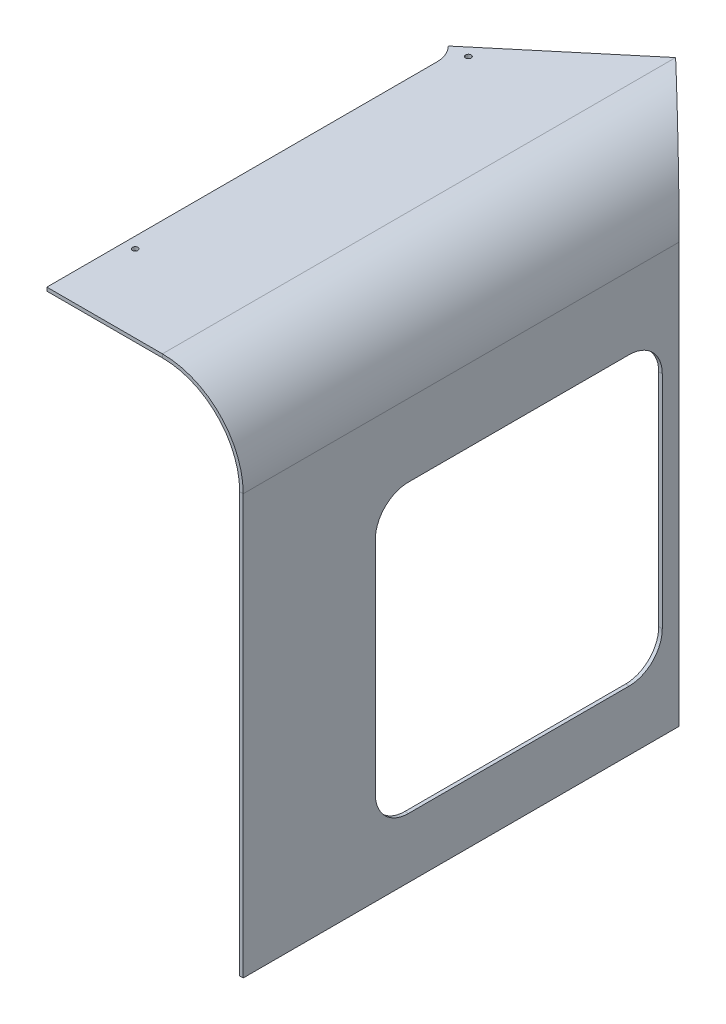
ISO-10303-21;
HEADER;
FILE_DESCRIPTION(('STEP AP214'),'2;1');
FILE_NAME('part.step','',(''),(''),'','','');
FILE_SCHEMA(('AUTOMOTIVE_DESIGN { 1 0 10303 214 1 1 1 1 }'));
ENDSEC;
DATA;
#1=APPLICATION_CONTEXT('core data for automotive mechanical design processes');
#2=APPLICATION_PROTOCOL_DEFINITION('international standard','automotive_design',2000,#1);
#3=PRODUCT_CONTEXT('',#1,'mechanical');
#4=PRODUCT('Part','Part','',(#3));
#5=PRODUCT_RELATED_PRODUCT_CATEGORY('part','',(#4));
#6=PRODUCT_DEFINITION_FORMATION('','',#4);
#7=PRODUCT_DEFINITION_CONTEXT('part definition',#1,'design');
#8=PRODUCT_DEFINITION('design','',#6,#7);
#9=PRODUCT_DEFINITION_SHAPE('','',#8);
#10=(LENGTH_UNIT() NAMED_UNIT(*) SI_UNIT(.MILLI.,.METRE.));
#11=(NAMED_UNIT(*) PLANE_ANGLE_UNIT() SI_UNIT($,.RADIAN.));
#12=(NAMED_UNIT(*) SI_UNIT($,.STERADIAN.) SOLID_ANGLE_UNIT());
#13=UNCERTAINTY_MEASURE_WITH_UNIT(LENGTH_MEASURE(1.E-05),#10,'distance_accuracy_value','');
#14=(GEOMETRIC_REPRESENTATION_CONTEXT(3) GLOBAL_UNCERTAINTY_ASSIGNED_CONTEXT((#13)) GLOBAL_UNIT_ASSIGNED_CONTEXT((#10,
#11,#12)) REPRESENTATION_CONTEXT('',''));
#15=CARTESIAN_POINT('',(0.,0.,0.));
#16=DIRECTION('',(0.,0.,1.));
#17=DIRECTION('',(1.,0.,0.));
#18=AXIS2_PLACEMENT_3D('',#15,#16,#17);
#19=CARTESIAN_POINT('',(250.,-0.0101030776406552,-195.));
#20=DIRECTION('',(-0.642404184639349,0.,-0.766366011483973));
#21=DIRECTION('',(-0.766366011483973,0.,0.642404184639349));
#22=AXIS2_PLACEMENT_3D('',#19,#20,#21);
#23=PLANE('',#22);
#24=DIRECTION('',(0.,1.,0.));
#25=VECTOR('',#24,1.);
#26=CARTESIAN_POINT('',(250.,450.,-195.));
#27=LINE('',#26,#25);
#28=CARTESIAN_POINT('',(250.,450.,-195.));
#29=VERTEX_POINT('',#28);
#30=CARTESIAN_POINT('',(250.,453.2,-195.));
#31=VERTEX_POINT('',#30);
#32=EDGE_CURVE('E177',#29,#31,#27,.T.);
#33=ORIENTED_EDGE('',*,*,#32,.F.);
#34=DIRECTION('',(-0.766366011483973,0.,0.642404184639349));
#35=VECTOR('',#34,1.);
#36=CARTESIAN_POINT('',(-235.661957548569,450.,212.104789583773));
#37=LINE('',#36,#35);
#38=CARTESIAN_POINT('',(137.949402277664,450.,-101.073897081128));
#39=VERTEX_POINT('',#38);
#40=EDGE_CURVE('E163',#29,#39,#37,.T.);
#41=ORIENTED_EDGE('',*,*,#40,.T.);
#42=DIRECTION('',(0.,1.,0.));
#43=VECTOR('',#42,1.);
#44=CARTESIAN_POINT('',(137.949402277664,353.2,-101.073897081128));
#45=LINE('',#44,#43);
#46=CARTESIAN_POINT('',(137.949402277664,453.2,-101.073897081128));
#47=VERTEX_POINT('',#46);
#48=EDGE_CURVE('E175',#39,#47,#45,.T.);
#49=ORIENTED_EDGE('',*,*,#48,.T.);
#50=DIRECTION('',(-0.766366011483973,0.,0.642404184639349));
#51=VECTOR('',#50,1.);
#52=CARTESIAN_POINT('',(-235.661957548569,453.2,212.104789583773));
#53=LINE('',#52,#51);
#54=EDGE_CURVE('E178',#31,#47,#53,.T.);
#55=ORIENTED_EDGE('',*,*,#54,.F.);
#56=EDGE_LOOP('',(#33,#41,#49,#55));
#57=FACE_BOUND('',#56,.T.);
#58=ADVANCED_FACE('F39',(#57),#23,.T.);
#59=CARTESIAN_POINT('',(320.,0.,270.));
#60=DIRECTION('',(0.,0.,1.));
#61=DIRECTION('',(0.,-1.,0.));
#62=AXIS2_PLACEMENT_3D('',#59,#60,#61);
#63=PLANE('',#62);
#64=DIRECTION('',(1.,0.,0.));
#65=VECTOR('',#64,1.);
#66=CARTESIAN_POINT('',(320.,380.,269.999999999309));
#67=LINE('',#66,#65);
#68=CARTESIAN_POINT('',(320.,380.,269.999999999309));
#69=VERTEX_POINT('',#68);
#70=CARTESIAN_POINT('',(323.2,380.,269.999999999309));
#71=VERTEX_POINT('',#70);
#72=EDGE_CURVE('E384',#69,#71,#67,.T.);
#73=ORIENTED_EDGE('',*,*,#72,.F.);
#74=DIRECTION('',(0.,-1.,0.));
#75=VECTOR('',#74,1.);
#76=CARTESIAN_POINT('',(320.,0.,270.));
#77=LINE('',#76,#75);
#78=CARTESIAN_POINT('',(320.,0.,270.));
#79=VERTEX_POINT('',#78);
#80=EDGE_CURVE('E305',#69,#79,#77,.T.);
#81=ORIENTED_EDGE('',*,*,#80,.T.);
#82=DIRECTION('',(1.,0.,0.));
#83=VECTOR('',#82,1.);
#84=CARTESIAN_POINT('',(320.,0.,270.));
#85=LINE('',#84,#83);
#86=CARTESIAN_POINT('',(323.2,0.,270.));
#87=VERTEX_POINT('',#86);
#88=EDGE_CURVE('E381',#79,#87,#85,.T.);
#89=ORIENTED_EDGE('',*,*,#88,.T.);
#90=DIRECTION('',(0.,1.,0.));
#91=VECTOR('',#90,1.);
#92=CARTESIAN_POINT('',(323.2,450.,269.999999999309));
#93=LINE('',#92,#91);
#94=EDGE_CURVE('E283',#71,#87,#93,.F.);
#95=ORIENTED_EDGE('',*,*,#94,.F.);
#96=EDGE_LOOP('',(#73,#81,#89,#95));
#97=FACE_BOUND('',#96,.T.);
#98=ADVANCED_FACE('F397',(#97),#63,.T.);
#99=CARTESIAN_POINT('',(320.,0.,-265.));
#100=DIRECTION('',(0.,1.,0.));
#101=DIRECTION('',(0.,0.,1.));
#102=AXIS2_PLACEMENT_3D('',#99,#100,#101);
#103=PLANE('',#102);
#104=ORIENTED_EDGE('',*,*,#88,.F.);
#105=DIRECTION('',(0.,0.,1.));
#106=VECTOR('',#105,1.);
#107=CARTESIAN_POINT('',(320.,0.,-265.));
#108=LINE('',#107,#106);
#109=CARTESIAN_POINT('',(320.,8.88178419700125E-13,-125.));
#110=VERTEX_POINT('',#109);
#111=EDGE_CURVE('E316',#110,#79,#108,.T.);
#112=ORIENTED_EDGE('',*,*,#111,.F.);
#113=DIRECTION('',(1.,0.,0.));
#114=VECTOR('',#113,1.);
#115=CARTESIAN_POINT('',(320.,8.88178419700125E-13,-125.));
#116=LINE('',#115,#114);
#117=CARTESIAN_POINT('',(323.2,8.88178419700125E-13,-125.));
#118=VERTEX_POINT('',#117);
#119=EDGE_CURVE('E376',#110,#118,#116,.T.);
#120=ORIENTED_EDGE('',*,*,#119,.T.);
#121=DIRECTION('',(0.,0.,-1.));
#122=VECTOR('',#121,1.);
#123=CARTESIAN_POINT('',(323.2,8.88178419700125E-13,-265.));
#124=LINE('',#123,#122);
#125=EDGE_CURVE('E299',#118,#87,#124,.F.);
#126=ORIENTED_EDGE('',*,*,#125,.T.);
#127=EDGE_LOOP('',(#104,#112,#120,#126));
#128=FACE_BOUND('',#127,.T.);
#129=ADVANCED_FACE('F379',(#128),#103,.F.);
#130=CARTESIAN_POINT('',(323.2,450.,-265.));
#131=DIRECTION('',(1.,0.,0.));
#132=DIRECTION('',(0.,0.,-1.));
#133=AXIS2_PLACEMENT_3D('',#130,#131,#132);
#134=PLANE('',#133);
#135=DIRECTION('',(0.,1.,0.));
#136=VECTOR('',#135,1.);
#137=CARTESIAN_POINT('',(323.2,314.267870560164,-109.716770430356));
#138=LINE('',#137,#136);
#139=CARTESIAN_POINT('',(323.2,84.2678705601637,-109.716770430356));
#140=VERTEX_POINT('',#139);
#141=CARTESIAN_POINT('',(323.2,284.267870560164,-109.716770430356));
#142=VERTEX_POINT('',#141);
#143=EDGE_CURVE('E245',#140,#142,#138,.T.);
#144=ORIENTED_EDGE('',*,*,#143,.F.);
#145=CARTESIAN_POINT('',(323.2,84.2678705601637,-79.716770430356));
#146=DIRECTION('',(1.,0.,0.));
#147=DIRECTION('',(0.,0.,-1.));
#148=AXIS2_PLACEMENT_3D('',#145,#146,#147);
#149=CIRCLE('',#148,30.);
#150=CARTESIAN_POINT('',(323.2,54.2678705601637,-79.716770430356));
#151=VERTEX_POINT('',#150);
#152=EDGE_CURVE('E227',#140,#151,#149,.F.);
#153=ORIENTED_EDGE('',*,*,#152,.T.);
#154=DIRECTION('',(0.,0.,-1.));
#155=VECTOR('',#154,1.);
#156=CARTESIAN_POINT('',(323.2,54.2678705601637,150.283229569644));
#157=LINE('',#156,#155);
#158=CARTESIAN_POINT('',(323.2,54.2678705601637,120.283229569644));
#159=VERTEX_POINT('',#158);
#160=EDGE_CURVE('E183',#159,#151,#157,.T.);
#161=ORIENTED_EDGE('',*,*,#160,.F.);
#162=CARTESIAN_POINT('',(323.2,84.2678705601637,120.283229569644));
#163=DIRECTION('',(1.,0.,0.));
#164=DIRECTION('',(0.,0.,-1.));
#165=AXIS2_PLACEMENT_3D('',#162,#163,#164);
#166=CIRCLE('',#165,30.);
#167=CARTESIAN_POINT('',(323.2,84.2678705601637,150.283229569644));
#168=VERTEX_POINT('',#167);
#169=EDGE_CURVE('E223',#159,#168,#166,.F.);
#170=ORIENTED_EDGE('',*,*,#169,.T.);
#171=DIRECTION('',(0.,-1.,0.));
#172=VECTOR('',#171,1.);
#173=CARTESIAN_POINT('',(323.2,314.267870560164,150.283229569644));
#174=LINE('',#173,#172);
#175=CARTESIAN_POINT('',(323.2,284.267870560164,150.283229569644));
#176=VERTEX_POINT('',#175);
#177=EDGE_CURVE('E186',#176,#168,#174,.T.);
#178=ORIENTED_EDGE('',*,*,#177,.F.);
#179=CARTESIAN_POINT('',(323.2,284.267870560164,120.283229569644));
#180=DIRECTION('',(1.,0.,0.));
#181=DIRECTION('',(0.,0.,-1.));
#182=AXIS2_PLACEMENT_3D('',#179,#180,#181);
#183=CIRCLE('',#182,30.);
#184=CARTESIAN_POINT('',(323.2,314.267870560164,120.283229569644));
#185=VERTEX_POINT('',#184);
#186=EDGE_CURVE('E47',#176,#185,#183,.F.);
#187=ORIENTED_EDGE('',*,*,#186,.T.);
#188=DIRECTION('',(0.,0.,1.));
#189=VECTOR('',#188,1.);
#190=CARTESIAN_POINT('',(323.2,314.267870560164,150.283229569644));
#191=LINE('',#190,#189);
#192=CARTESIAN_POINT('',(323.2,314.267870560164,-79.716770430356));
#193=VERTEX_POINT('',#192);
#194=EDGE_CURVE('E239',#193,#185,#191,.T.);
#195=ORIENTED_EDGE('',*,*,#194,.F.);
#196=CARTESIAN_POINT('',(323.2,284.267870560164,-79.716770430356));
#197=DIRECTION('',(1.,0.,0.));
#198=DIRECTION('',(0.,0.,-1.));
#199=AXIS2_PLACEMENT_3D('',#196,#197,#198);
#200=CIRCLE('',#199,30.);
#201=EDGE_CURVE('E231',#193,#142,#200,.F.);
#202=ORIENTED_EDGE('',*,*,#201,.T.);
#203=EDGE_LOOP('',(#144,#153,#161,#170,#178,#187,#195,#202));
#204=FACE_BOUND('',#203,.T.);
#205=ORIENTED_EDGE('',*,*,#125,.F.);
#206=DIRECTION('',(0.,1.,0.));
#207=VECTOR('',#206,1.);
#208=CARTESIAN_POINT('',(323.2,450.,-125.));
#209=LINE('',#208,#207);
#210=CARTESIAN_POINT('',(323.2,380.,-125.));
#211=VERTEX_POINT('',#210);
#212=EDGE_CURVE('E332',#211,#118,#209,.F.);
#213=ORIENTED_EDGE('',*,*,#212,.F.);
#214=DIRECTION('',(0.,0.,-1.));
#215=VECTOR('',#214,1.);
#216=CARTESIAN_POINT('',(323.2,380.,-265.));
#217=LINE('',#216,#215);
#218=EDGE_CURVE('E328',#211,#71,#217,.F.);
#219=ORIENTED_EDGE('',*,*,#218,.T.);
#220=ORIENTED_EDGE('',*,*,#94,.T.);
#221=EDGE_LOOP('',(#205,#213,#219,#220));
#222=FACE_BOUND('',#221,.T.);
#223=ADVANCED_FACE('F237',(#204,#222),#134,.T.);
#224=CARTESIAN_POINT('',(250.,380.,269.999999998618));
#225=DIRECTION('',(0.,0.,-1.));
#226=DIRECTION('',(-1.,0.,0.));
#227=AXIS2_PLACEMENT_3D('',#224,#225,#226);
#228=PLANE('',#227);
#229=DIRECTION('',(0.,1.,0.));
#230=VECTOR('',#229,1.);
#231=CARTESIAN_POINT('',(250.,450.,269.999999999309));
#232=LINE('',#231,#230);
#233=CARTESIAN_POINT('',(250.,450.,269.999999999309));
#234=VERTEX_POINT('',#233);
#235=CARTESIAN_POINT('',(250.,453.2,269.999999999309));
#236=VERTEX_POINT('',#235);
#237=EDGE_CURVE('E386',#234,#236,#232,.T.);
#238=ORIENTED_EDGE('',*,*,#237,.F.);
#239=CARTESIAN_POINT('',(250.,380.,269.999999998618));
#240=DIRECTION('',(0.,0.,1.));
#241=DIRECTION('',(1.,0.,0.));
#242=AXIS2_PLACEMENT_3D('',#239,#240,#241);
#243=CIRCLE('',#242,70.);
#244=EDGE_CURVE('E294',#234,#69,#243,.F.);
#245=ORIENTED_EDGE('',*,*,#244,.T.);
#246=ORIENTED_EDGE('',*,*,#72,.T.);
#247=CARTESIAN_POINT('',(250.,380.,269.999999999309));
#248=DIRECTION('',(0.,0.,1.));
#249=DIRECTION('',(1.,0.,0.));
#250=AXIS2_PLACEMENT_3D('',#247,#248,#249);
#251=CIRCLE('',#250,73.2);
#252=EDGE_CURVE('E320',#236,#71,#251,.F.);
#253=ORIENTED_EDGE('',*,*,#252,.F.);
#254=EDGE_LOOP('',(#238,#245,#246,#253));
#255=FACE_BOUND('',#254,.T.);
#256=ADVANCED_FACE('F396',(#255),#228,.F.);
#257=CARTESIAN_POINT('',(320.,450.,-265.));
#258=DIRECTION('',(1.,0.,0.));
#259=DIRECTION('',(0.,0.,-1.));
#260=AXIS2_PLACEMENT_3D('',#257,#258,#259);
#261=PLANE('',#260);
#262=DIRECTION('',(0.,-1.,0.));
#263=VECTOR('',#262,1.);
#264=CARTESIAN_POINT('',(320.,450.,150.283229569644));
#265=LINE('',#264,#263);
#266=CARTESIAN_POINT('',(320.,284.267870560164,150.283229569644));
#267=VERTEX_POINT('',#266);
#268=CARTESIAN_POINT('',(320.,84.2678705601637,150.283229569644));
#269=VERTEX_POINT('',#268);
#270=EDGE_CURVE('E195',#267,#269,#265,.T.);
#271=ORIENTED_EDGE('',*,*,#270,.T.);
#272=CARTESIAN_POINT('',(320.,84.2678705601637,120.283229569644));
#273=DIRECTION('',(1.,0.,0.));
#274=DIRECTION('',(0.,0.,-1.));
#275=AXIS2_PLACEMENT_3D('',#272,#273,#274);
#276=CIRCLE('',#275,30.);
#277=CARTESIAN_POINT('',(320.,54.2678705601637,120.283229569644));
#278=VERTEX_POINT('',#277);
#279=EDGE_CURVE('E225',#269,#278,#276,.T.);
#280=ORIENTED_EDGE('',*,*,#279,.T.);
#281=DIRECTION('',(0.,0.,-1.));
#282=VECTOR('',#281,1.);
#283=CARTESIAN_POINT('',(320.,54.2678705601637,-265.));
#284=LINE('',#283,#282);
#285=CARTESIAN_POINT('',(320.,54.2678705601637,-79.716770430356));
#286=VERTEX_POINT('',#285);
#287=EDGE_CURVE('E199',#278,#286,#284,.T.);
#288=ORIENTED_EDGE('',*,*,#287,.T.);
#289=CARTESIAN_POINT('',(320.,84.2678705601637,-79.716770430356));
#290=DIRECTION('',(1.,0.,0.));
#291=DIRECTION('',(0.,0.,-1.));
#292=AXIS2_PLACEMENT_3D('',#289,#290,#291);
#293=CIRCLE('',#292,30.);
#294=CARTESIAN_POINT('',(320.,84.2678705601637,-109.716770430356));
#295=VERTEX_POINT('',#294);
#296=EDGE_CURVE('E229',#286,#295,#293,.T.);
#297=ORIENTED_EDGE('',*,*,#296,.T.);
#298=DIRECTION('',(0.,1.,0.));
#299=VECTOR('',#298,1.);
#300=CARTESIAN_POINT('',(320.,450.,-109.716770430356));
#301=LINE('',#300,#299);
#302=CARTESIAN_POINT('',(320.,284.267870560164,-109.716770430356));
#303=VERTEX_POINT('',#302);
#304=EDGE_CURVE('E202',#295,#303,#301,.T.);
#305=ORIENTED_EDGE('',*,*,#304,.T.);
#306=CARTESIAN_POINT('',(320.,284.267870560164,-79.716770430356));
#307=DIRECTION('',(1.,0.,0.));
#308=DIRECTION('',(0.,0.,-1.));
#309=AXIS2_PLACEMENT_3D('',#306,#307,#308);
#310=CIRCLE('',#309,30.);
#311=CARTESIAN_POINT('',(320.,314.267870560164,-79.716770430356));
#312=VERTEX_POINT('',#311);
#313=EDGE_CURVE('E61',#303,#312,#310,.T.);
#314=ORIENTED_EDGE('',*,*,#313,.T.);
#315=DIRECTION('',(0.,0.,1.));
#316=VECTOR('',#315,1.);
#317=CARTESIAN_POINT('',(320.,314.267870560164,-265.));
#318=LINE('',#317,#316);
#319=CARTESIAN_POINT('',(320.,314.267870560164,120.283229569644));
#320=VERTEX_POINT('',#319);
#321=EDGE_CURVE('E193',#312,#320,#318,.T.);
#322=ORIENTED_EDGE('',*,*,#321,.T.);
#323=CARTESIAN_POINT('',(320.,284.267870560164,120.283229569644));
#324=DIRECTION('',(1.,0.,0.));
#325=DIRECTION('',(0.,0.,-1.));
#326=AXIS2_PLACEMENT_3D('',#323,#324,#325);
#327=CIRCLE('',#326,30.);
#328=EDGE_CURVE('E11',#320,#267,#327,.T.);
#329=ORIENTED_EDGE('',*,*,#328,.T.);
#330=EDGE_LOOP('',(#271,#280,#288,#297,#305,#314,#322,#329));
#331=FACE_BOUND('',#330,.T.);
#332=ORIENTED_EDGE('',*,*,#111,.T.);
#333=ORIENTED_EDGE('',*,*,#80,.F.);
#334=DIRECTION('',(0.,0.,1.));
#335=VECTOR('',#334,1.);
#336=CARTESIAN_POINT('',(320.,380.,-265.));
#337=LINE('',#336,#335);
#338=CARTESIAN_POINT('',(320.,380.,-125.));
#339=VERTEX_POINT('',#338);
#340=EDGE_CURVE('E309',#339,#69,#337,.T.);
#341=ORIENTED_EDGE('',*,*,#340,.F.);
#342=DIRECTION('',(0.,-1.,0.));
#343=VECTOR('',#342,1.);
#344=CARTESIAN_POINT('',(320.,2193.73346549275,-125.));
#345=LINE('',#344,#343);
#346=EDGE_CURVE('E312',#339,#110,#345,.T.);
#347=ORIENTED_EDGE('',*,*,#346,.T.);
#348=EDGE_LOOP('',(#332,#333,#341,#347));
#349=FACE_BOUND('',#348,.T.);
#350=ADVANCED_FACE('F249',(#331,#349),#261,.F.);
#351=CARTESIAN_POINT('',(250.,380.,-265.));
#352=DIRECTION('',(0.,0.,1.));
#353=DIRECTION('',(1.,0.,0.));
#354=AXIS2_PLACEMENT_3D('',#351,#352,#353);
#355=CYLINDRICAL_SURFACE('',#354,70.);
#356=ORIENTED_EDGE('',*,*,#340,.T.);
#357=ORIENTED_EDGE('',*,*,#244,.F.);
#358=DIRECTION('',(0.,0.,1.));
#359=VECTOR('',#358,1.);
#360=CARTESIAN_POINT('',(250.,450.,195.));
#361=LINE('',#360,#359);
#362=EDGE_CURVE('E303',#234,#29,#361,.F.);
#363=ORIENTED_EDGE('',*,*,#362,.T.);
#364=CARTESIAN_POINT('',(250.,380.,-195.));
#365=DIRECTION('',(0.707106781186547,0.,-0.707106781186548));
#366=DIRECTION('',(0.707106781186548,0.,0.707106781186547));
#367=AXIS2_PLACEMENT_3D('',#364,#365,#366);
#368=ELLIPSE('',#367,98.9949493661167,70.);
#369=EDGE_CURVE('E298',#339,#29,#368,.F.);
#370=ORIENTED_EDGE('',*,*,#369,.F.);
#371=EDGE_LOOP('',(#356,#357,#363,#370));
#372=FACE_BOUND('',#371,.T.);
#373=ADVANCED_FACE('F370',(#372),#355,.F.);
#374=CARTESIAN_POINT('',(-250.,450.,195.));
#375=DIRECTION('',(0.,1.,0.));
#376=DIRECTION('',(0.,0.,1.));
#377=AXIS2_PLACEMENT_3D('',#374,#375,#376);
#378=PLANE('',#377);
#379=CARTESIAN_POINT('',(155.271732748,450.,-101.960676968146));
#380=DIRECTION('',(0.,1.,0.));
#381=DIRECTION('',(0.,0.,1.));
#382=AXIS2_PLACEMENT_3D('',#379,#380,#381);
#383=CIRCLE('',#382,2.5);
#384=CARTESIAN_POINT('',(155.271732748,450.,-99.4606769681461));
#385=VERTEX_POINT('',#384);
#386=EDGE_CURVE('E349',#385,#385,#383,.T.);
#387=ORIENTED_EDGE('',*,*,#386,.T.);
#388=EDGE_LOOP('',(#387));
#389=FACE_BOUND('',#388,.T.);
#390=CARTESIAN_POINT('',(155.271732748,450.,200.));
#391=DIRECTION('',(0.,1.,0.));
#392=DIRECTION('',(0.,0.,1.));
#393=AXIS2_PLACEMENT_3D('',#390,#391,#392);
#394=CIRCLE('',#393,2.5);
#395=CARTESIAN_POINT('',(155.271732748,450.,202.5));
#396=VERTEX_POINT('',#395);
#397=EDGE_CURVE('E346',#396,#396,#394,.T.);
#398=ORIENTED_EDGE('',*,*,#397,.T.);
#399=EDGE_LOOP('',(#398));
#400=FACE_BOUND('',#399,.T.);
#401=ORIENTED_EDGE('',*,*,#40,.F.);
#402=ORIENTED_EDGE('',*,*,#362,.F.);
#403=DIRECTION('',(1.,0.,0.));
#404=VECTOR('',#403,1.);
#405=CARTESIAN_POINT('',(-250.,450.,270.));
#406=LINE('',#405,#404);
#407=CARTESIAN_POINT('',(145.271732748,450.,270.));
#408=VERTEX_POINT('',#407);
#409=EDGE_CURVE('E285',#408,#234,#406,.T.);
#410=ORIENTED_EDGE('',*,*,#409,.F.);
#411=DIRECTION('',(0.,0.,-1.));
#412=VECTOR('',#411,1.);
#413=CARTESIAN_POINT('',(145.271732748,450.,195.));
#414=LINE('',#413,#412);
#415=CARTESIAN_POINT('',(145.271732748,450.,-83.3962275514645));
#416=VERTEX_POINT('',#415);
#417=EDGE_CURVE('E166',#408,#416,#414,.T.);
#418=ORIENTED_EDGE('',*,*,#417,.T.);
#419=CARTESIAN_POINT('',(120.271732748,450.,-83.3962275514645));
#420=DIRECTION('',(0.,1.,0.));
#421=DIRECTION('',(0.,0.,1.));
#422=AXIS2_PLACEMENT_3D('',#419,#420,#421);
#423=CIRCLE('',#422,25.);
#424=EDGE_CURVE('E159',#416,#39,#423,.T.);
#425=ORIENTED_EDGE('',*,*,#424,.T.);
#426=EDGE_LOOP('',(#401,#402,#410,#418,#425));
#427=FACE_BOUND('',#426,.T.);
#428=ADVANCED_FACE('F161',(#389,#400,#427),#378,.F.);
#429=CARTESIAN_POINT('',(-250.,450.,270.));
#430=DIRECTION('',(0.,0.,1.));
#431=DIRECTION('',(1.,0.,0.));
#432=AXIS2_PLACEMENT_3D('',#429,#430,#431);
#433=PLANE('',#432);
#434=DIRECTION('',(1.,0.,0.));
#435=VECTOR('',#434,1.);
#436=CARTESIAN_POINT('',(-250.,453.2,270.));
#437=LINE('',#436,#435);
#438=CARTESIAN_POINT('',(145.271732748,453.2,270.));
#439=VERTEX_POINT('',#438);
#440=EDGE_CURVE('E279',#439,#236,#437,.T.);
#441=ORIENTED_EDGE('',*,*,#440,.F.);
#442=DIRECTION('',(0.,-1.,0.));
#443=VECTOR('',#442,1.);
#444=CARTESIAN_POINT('',(145.271732748,450.,270.));
#445=LINE('',#444,#443);
#446=EDGE_CURVE('E170',#439,#408,#445,.T.);
#447=ORIENTED_EDGE('',*,*,#446,.T.);
#448=ORIENTED_EDGE('',*,*,#409,.T.);
#449=ORIENTED_EDGE('',*,*,#237,.T.);
#450=EDGE_LOOP('',(#441,#447,#448,#449));
#451=FACE_BOUND('',#450,.T.);
#452=ADVANCED_FACE('F394',(#451),#433,.T.);
#453=CARTESIAN_POINT('',(145.271732748,353.2,-83.3962275514645));
#454=DIRECTION('',(1.,0.,0.));
#455=DIRECTION('',(0.,0.,-1.));
#456=AXIS2_PLACEMENT_3D('',#453,#454,#455);
#457=PLANE('',#456);
#458=ORIENTED_EDGE('',*,*,#417,.F.);
#459=ORIENTED_EDGE('',*,*,#446,.F.);
#460=DIRECTION('',(0.,0.,-1.));
#461=VECTOR('',#460,1.);
#462=CARTESIAN_POINT('',(145.271732748,453.2,-83.3962275514645));
#463=LINE('',#462,#461);
#464=CARTESIAN_POINT('',(145.271732748,453.2,-83.3962275514645));
#465=VERTEX_POINT('',#464);
#466=EDGE_CURVE('E191',#439,#465,#463,.T.);
#467=ORIENTED_EDGE('',*,*,#466,.T.);
#468=DIRECTION('',(0.,1.,0.));
#469=VECTOR('',#468,1.);
#470=CARTESIAN_POINT('',(145.271732748,353.2,-83.3962275514645));
#471=LINE('',#470,#469);
#472=EDGE_CURVE('E192',#416,#465,#471,.T.);
#473=ORIENTED_EDGE('',*,*,#472,.F.);
#474=EDGE_LOOP('',(#458,#459,#467,#473));
#475=FACE_BOUND('',#474,.T.);
#476=ADVANCED_FACE('F454',(#475),#457,.F.);
#477=CARTESIAN_POINT('',(120.271732748,353.2,-83.3962275514645));
#478=DIRECTION('',(0.,1.,0.));
#479=DIRECTION('',(0.,0.,1.));
#480=AXIS2_PLACEMENT_3D('',#477,#478,#479);
#481=CYLINDRICAL_SURFACE('',#480,25.);
#482=ORIENTED_EDGE('',*,*,#48,.F.);
#483=ORIENTED_EDGE('',*,*,#424,.F.);
#484=ORIENTED_EDGE('',*,*,#472,.T.);
#485=CARTESIAN_POINT('',(120.271732748,453.2,-83.3962275514645));
#486=DIRECTION('',(0.,1.,0.));
#487=DIRECTION('',(0.,0.,-1.));
#488=AXIS2_PLACEMENT_3D('',#485,#486,#487);
#489=CIRCLE('',#488,25.);
#490=EDGE_CURVE('E182',#465,#47,#489,.T.);
#491=ORIENTED_EDGE('',*,*,#490,.T.);
#492=EDGE_LOOP('',(#482,#483,#484,#491));
#493=FACE_BOUND('',#492,.T.);
#494=ADVANCED_FACE('F180',(#493),#481,.F.);
#495=CARTESIAN_POINT('',(250.,380.,-265.));
#496=DIRECTION('',(0.,0.,1.));
#497=DIRECTION('',(1.,0.,0.));
#498=AXIS2_PLACEMENT_3D('',#495,#496,#497);
#499=CYLINDRICAL_SURFACE('',#498,73.2);
#500=ORIENTED_EDGE('',*,*,#218,.F.);
#501=CARTESIAN_POINT('',(250.,380.,-195.));
#502=DIRECTION('',(0.691132971722828,0.,-0.722727621858729));
#503=DIRECTION('',(0.722727621858729,0.,0.691132971722828));
#504=AXIS2_PLACEMENT_3D('',#501,#502,#503);
#505=ELLIPSE('',#504,101.282969940657,73.2);
#506=EDGE_CURVE('E324',#211,#31,#505,.F.);
#507=ORIENTED_EDGE('',*,*,#506,.T.);
#508=DIRECTION('',(0.,0.,1.));
#509=VECTOR('',#508,1.);
#510=CARTESIAN_POINT('',(250.,453.2,195.));
#511=LINE('',#510,#509);
#512=EDGE_CURVE('E284',#236,#31,#511,.F.);
#513=ORIENTED_EDGE('',*,*,#512,.F.);
#514=ORIENTED_EDGE('',*,*,#252,.T.);
#515=EDGE_LOOP('',(#500,#507,#513,#514));
#516=FACE_BOUND('',#515,.T.);
#517=ADVANCED_FACE('F363',(#516),#499,.T.);
#518=CARTESIAN_POINT('',(155.271732748,423.2,200.));
#519=DIRECTION('',(0.,1.,0.));
#520=DIRECTION('',(0.,0.,1.));
#521=AXIS2_PLACEMENT_3D('',#518,#519,#520);
#522=CYLINDRICAL_SURFACE('',#521,2.5);
#523=CARTESIAN_POINT('',(155.271732748,453.2,200.));
#524=DIRECTION('',(0.,1.,0.));
#525=DIRECTION('',(0.,0.,1.));
#526=AXIS2_PLACEMENT_3D('',#523,#524,#525);
#527=CIRCLE('',#526,2.5);
#528=CARTESIAN_POINT('',(155.271732748,453.2,202.5));
#529=VERTEX_POINT('',#528);
#530=EDGE_CURVE('E352',#529,#529,#527,.T.);
#531=ORIENTED_EDGE('',*,*,#530,.T.);
#532=EDGE_LOOP('',(#531));
#533=FACE_BOUND('',#532,.T.);
#534=ORIENTED_EDGE('',*,*,#397,.F.);
#535=EDGE_LOOP('',(#534));
#536=FACE_BOUND('',#535,.T.);
#537=ADVANCED_FACE('F475',(#533,#536),#522,.F.);
#538=CARTESIAN_POINT('',(155.271732748,423.2,-101.960676968146));
#539=DIRECTION('',(0.,1.,0.));
#540=DIRECTION('',(0.,0.,1.));
#541=AXIS2_PLACEMENT_3D('',#538,#539,#540);
#542=CYLINDRICAL_SURFACE('',#541,2.5);
#543=CARTESIAN_POINT('',(155.271732748,453.2,-101.960676968146));
#544=DIRECTION('',(0.,1.,0.));
#545=DIRECTION('',(0.,0.,1.));
#546=AXIS2_PLACEMENT_3D('',#543,#544,#545);
#547=CIRCLE('',#546,2.5);
#548=CARTESIAN_POINT('',(155.271732748,453.2,-99.4606769681461));
#549=VERTEX_POINT('',#548);
#550=EDGE_CURVE('E196',#549,#549,#547,.T.);
#551=ORIENTED_EDGE('',*,*,#550,.T.);
#552=EDGE_LOOP('',(#551));
#553=FACE_BOUND('',#552,.T.);
#554=ORIENTED_EDGE('',*,*,#386,.F.);
#555=EDGE_LOOP('',(#554));
#556=FACE_BOUND('',#555,.T.);
#557=ADVANCED_FACE('F482',(#553,#556),#542,.F.);
#558=CARTESIAN_POINT('',(-250.,453.2,195.));
#559=DIRECTION('',(0.,1.,0.));
#560=DIRECTION('',(0.,0.,1.));
#561=AXIS2_PLACEMENT_3D('',#558,#559,#560);
#562=PLANE('',#561);
#563=ORIENTED_EDGE('',*,*,#550,.F.);
#564=EDGE_LOOP('',(#563));
#565=FACE_BOUND('',#564,.T.);
#566=ORIENTED_EDGE('',*,*,#530,.F.);
#567=EDGE_LOOP('',(#566));
#568=FACE_BOUND('',#567,.T.);
#569=ORIENTED_EDGE('',*,*,#512,.T.);
#570=ORIENTED_EDGE('',*,*,#54,.T.);
#571=ORIENTED_EDGE('',*,*,#490,.F.);
#572=ORIENTED_EDGE('',*,*,#466,.F.);
#573=ORIENTED_EDGE('',*,*,#440,.T.);
#574=EDGE_LOOP('',(#569,#570,#571,#572,#573));
#575=FACE_BOUND('',#574,.T.);
#576=ADVANCED_FACE('F358',(#565,#568,#575),#562,.T.);
#577=CARTESIAN_POINT('',(320.,2193.73346549275,-125.));
#578=DIRECTION('',(0.,0.,1.));
#579=DIRECTION('',(0.,-1.,0.));
#580=AXIS2_PLACEMENT_3D('',#577,#578,#579);
#581=PLANE('',#580);
#582=ORIENTED_EDGE('',*,*,#119,.F.);
#583=ORIENTED_EDGE('',*,*,#346,.F.);
#584=DIRECTION('',(1.,0.,0.));
#585=VECTOR('',#584,1.);
#586=CARTESIAN_POINT('',(320.,380.,-125.));
#587=LINE('',#586,#585);
#588=EDGE_CURVE('E290',#339,#211,#587,.T.);
#589=ORIENTED_EDGE('',*,*,#588,.T.);
#590=ORIENTED_EDGE('',*,*,#212,.T.);
#591=EDGE_LOOP('',(#582,#583,#589,#590));
#592=FACE_BOUND('',#591,.T.);
#593=ADVANCED_FACE('F374',(#592),#581,.F.);
#594=CARTESIAN_POINT('',(323.2,380.,-125.));
#595=CARTESIAN_POINT('',(322.133333333333,380.,-125.));
#596=CARTESIAN_POINT('',(321.066666666667,380.,-125.));
#597=CARTESIAN_POINT('',(320.,380.,-125.));
#598=CARTESIAN_POINT('',(323.2,526.4,-125.));
#599=CARTESIAN_POINT('',(322.133333333333,524.266666666667,-125.));
#600=CARTESIAN_POINT('',(321.066666666667,522.133333333334,-125.));
#601=CARTESIAN_POINT('',(320.,520.,-125.));
#602=CARTESIAN_POINT('',(176.8,526.4,-265.));
#603=CARTESIAN_POINT('',(177.866666666667,524.266666666667,-265.));
#604=CARTESIAN_POINT('',(178.933333333333,522.133333333334,-265.));
#605=CARTESIAN_POINT('',(180.,520.,-265.));
#606=CARTESIAN_POINT('',(176.8,380.,-265.));
#607=CARTESIAN_POINT('',(177.866666666667,380.,-265.));
#608=CARTESIAN_POINT('',(178.933333333333,380.,-265.));
#609=CARTESIAN_POINT('',(180.,380.,-265.));
#610=CARTESIAN_POINT('',(176.8,233.6,-265.));
#611=CARTESIAN_POINT('',(177.866666666667,235.733333333333,-265.));
#612=CARTESIAN_POINT('',(178.933333333333,237.866666666667,-265.));
#613=CARTESIAN_POINT('',(180.,240.,-265.));
#614=CARTESIAN_POINT('',(323.2,233.6,-125.));
#615=CARTESIAN_POINT('',(322.133333333333,235.733333333333,-125.));
#616=CARTESIAN_POINT('',(321.066666666667,237.866666666667,-125.));
#617=CARTESIAN_POINT('',(320.,240.,-125.));
#618=CARTESIAN_POINT('',(323.2,380.,-125.));
#619=CARTESIAN_POINT('',(322.133333333333,380.,-125.));
#620=CARTESIAN_POINT('',(321.066666666667,380.,-125.));
#621=CARTESIAN_POINT('',(320.,380.,-125.));
#622=(BOUNDED_SURFACE() B_SPLINE_SURFACE(3,3,((#594,#595,#596,#597),(#598,#599,#600,#601),(#602,
#603,#604,#605),(#606,#607,#608,#609),(#610,#611,#612,#613),(#614,#615,#616,#617),(#618,#619,
#620,#621)),.UNSPECIFIED.,.T.,.F.,.F.) B_SPLINE_SURFACE_WITH_KNOTS((4,3,4),(4,4),(0.,0.5,1.),
(0.,1.),.UNSPECIFIED.) GEOMETRIC_REPRESENTATION_ITEM() RATIONAL_B_SPLINE_SURFACE(((1.,1.,1.,1.),
(0.333333333333333,0.333333333333333,0.333333333333333,0.333333333333333),(0.333333333333333,
0.333333333333333,0.333333333333333,0.333333333333333),(1.,1.,1.,1.),(0.333333333333333,
0.333333333333333,0.333333333333333,0.333333333333333),(0.333333333333333,0.333333333333333,
0.333333333333333,0.333333333333333),(1.,1.,1.,1.))) REPRESENTATION_ITEM('') SURFACE());
#623=ORIENTED_EDGE('',*,*,#588,.F.);
#624=ORIENTED_EDGE('',*,*,#369,.T.);
#625=ORIENTED_EDGE('',*,*,#32,.T.);
#626=ORIENTED_EDGE('',*,*,#506,.F.);
#627=EDGE_LOOP('',(#623,#624,#625,#626));
#628=FACE_BOUND('',#627,.T.);
#629=ADVANCED_FACE('F365',(#628),#622,.F.);
#630=CARTESIAN_POINT('',(137.949402277664,314.267870560164,-109.716770430356));
#631=DIRECTION('',(0.,0.,-1.));
#632=DIRECTION('',(0.,1.,0.));
#633=AXIS2_PLACEMENT_3D('',#630,#631,#632);
#634=PLANE('',#633);
#635=ORIENTED_EDGE('',*,*,#304,.F.);
#636=DIRECTION('',(1.,0.,0.));
#637=VECTOR('',#636,1.);
#638=CARTESIAN_POINT('',(323.2,84.2678705601637,-109.716770430356));
#639=LINE('',#638,#637);
#640=EDGE_CURVE('E216',#295,#140,#639,.T.);
#641=ORIENTED_EDGE('',*,*,#640,.T.);
#642=ORIENTED_EDGE('',*,*,#143,.T.);
#643=DIRECTION('',(1.,0.,0.));
#644=VECTOR('',#643,1.);
#645=CARTESIAN_POINT('',(320.,284.267870560164,-109.716770430356));
#646=LINE('',#645,#644);
#647=EDGE_CURVE('E214',#142,#303,#646,.F.);
#648=ORIENTED_EDGE('',*,*,#647,.T.);
#649=EDGE_LOOP('',(#635,#641,#642,#648));
#650=FACE_BOUND('',#649,.T.);
#651=ADVANCED_FACE('F269',(#650),#634,.F.);
#652=CARTESIAN_POINT('',(137.949402277664,54.2678705601637,150.283229569644));
#653=DIRECTION('',(0.,-1.,0.));
#654=DIRECTION('',(0.,0.,-1.));
#655=AXIS2_PLACEMENT_3D('',#652,#653,#654);
#656=PLANE('',#655);
#657=ORIENTED_EDGE('',*,*,#287,.F.);
#658=DIRECTION('',(1.,0.,0.));
#659=VECTOR('',#658,1.);
#660=CARTESIAN_POINT('',(323.2,54.2678705601637,120.283229569644));
#661=LINE('',#660,#659);
#662=EDGE_CURVE('E206',#278,#159,#661,.T.);
#663=ORIENTED_EDGE('',*,*,#662,.T.);
#664=ORIENTED_EDGE('',*,*,#160,.T.);
#665=DIRECTION('',(1.,0.,0.));
#666=VECTOR('',#665,1.);
#667=CARTESIAN_POINT('',(320.,54.2678705601637,-79.716770430356));
#668=LINE('',#667,#666);
#669=EDGE_CURVE('E204',#151,#286,#668,.F.);
#670=ORIENTED_EDGE('',*,*,#669,.T.);
#671=EDGE_LOOP('',(#657,#663,#664,#670));
#672=FACE_BOUND('',#671,.T.);
#673=ADVANCED_FACE('F261',(#672),#656,.F.);
#674=CARTESIAN_POINT('',(137.949402277664,314.267870560164,150.283229569644));
#675=DIRECTION('',(0.,0.,1.));
#676=DIRECTION('',(0.,-1.,0.));
#677=AXIS2_PLACEMENT_3D('',#674,#675,#676);
#678=PLANE('',#677);
#679=ORIENTED_EDGE('',*,*,#177,.T.);
#680=DIRECTION('',(1.,0.,0.));
#681=VECTOR('',#680,1.);
#682=CARTESIAN_POINT('',(320.,84.2678705601637,150.283229569644));
#683=LINE('',#682,#681);
#684=EDGE_CURVE('E212',#168,#269,#683,.F.);
#685=ORIENTED_EDGE('',*,*,#684,.T.);
#686=ORIENTED_EDGE('',*,*,#270,.F.);
#687=DIRECTION('',(1.,0.,0.));
#688=VECTOR('',#687,1.);
#689=CARTESIAN_POINT('',(323.2,284.267870560164,150.283229569644));
#690=LINE('',#689,#688);
#691=EDGE_CURVE('E209',#267,#176,#690,.T.);
#692=ORIENTED_EDGE('',*,*,#691,.T.);
#693=EDGE_LOOP('',(#679,#685,#686,#692));
#694=FACE_BOUND('',#693,.T.);
#695=ADVANCED_FACE('F253',(#694),#678,.F.);
#696=CARTESIAN_POINT('',(137.949402277664,314.267870560164,150.283229569644));
#697=DIRECTION('',(0.,1.,0.));
#698=DIRECTION('',(0.,0.,1.));
#699=AXIS2_PLACEMENT_3D('',#696,#697,#698);
#700=PLANE('',#699);
#701=ORIENTED_EDGE('',*,*,#321,.F.);
#702=DIRECTION('',(1.,0.,0.));
#703=VECTOR('',#702,1.);
#704=CARTESIAN_POINT('',(323.2,314.267870560164,-79.716770430356));
#705=LINE('',#704,#703);
#706=EDGE_CURVE('E220',#312,#193,#705,.T.);
#707=ORIENTED_EDGE('',*,*,#706,.T.);
#708=ORIENTED_EDGE('',*,*,#194,.T.);
#709=DIRECTION('',(1.,0.,0.));
#710=VECTOR('',#709,1.);
#711=CARTESIAN_POINT('',(320.,314.267870560164,120.283229569644));
#712=LINE('',#711,#710);
#713=EDGE_CURVE('E54',#185,#320,#712,.F.);
#714=ORIENTED_EDGE('',*,*,#713,.T.);
#715=EDGE_LOOP('',(#701,#707,#708,#714));
#716=FACE_BOUND('',#715,.T.);
#717=ADVANCED_FACE('F243',(#716),#700,.F.);
#718=CARTESIAN_POINT('',(137.949402277664,84.2678705601637,120.283229569644));
#719=DIRECTION('',(-1.,0.,0.));
#720=DIRECTION('',(0.,0.,1.));
#721=AXIS2_PLACEMENT_3D('',#718,#719,#720);
#722=CYLINDRICAL_SURFACE('',#721,30.);
#723=ORIENTED_EDGE('',*,*,#279,.F.);
#724=ORIENTED_EDGE('',*,*,#684,.F.);
#725=ORIENTED_EDGE('',*,*,#169,.F.);
#726=ORIENTED_EDGE('',*,*,#662,.F.);
#727=EDGE_LOOP('',(#723,#724,#725,#726));
#728=FACE_BOUND('',#727,.T.);
#729=ADVANCED_FACE('F256',(#728),#722,.F.);
#730=CARTESIAN_POINT('',(137.949402277664,84.2678705601637,-79.716770430356));
#731=DIRECTION('',(-1.,0.,0.));
#732=DIRECTION('',(0.,0.,1.));
#733=AXIS2_PLACEMENT_3D('',#730,#731,#732);
#734=CYLINDRICAL_SURFACE('',#733,30.);
#735=ORIENTED_EDGE('',*,*,#296,.F.);
#736=ORIENTED_EDGE('',*,*,#669,.F.);
#737=ORIENTED_EDGE('',*,*,#152,.F.);
#738=ORIENTED_EDGE('',*,*,#640,.F.);
#739=EDGE_LOOP('',(#735,#736,#737,#738));
#740=FACE_BOUND('',#739,.T.);
#741=ADVANCED_FACE('F265',(#740),#734,.F.);
#742=CARTESIAN_POINT('',(137.949402277664,284.267870560164,-79.716770430356));
#743=DIRECTION('',(-1.,0.,0.));
#744=DIRECTION('',(0.,0.,1.));
#745=AXIS2_PLACEMENT_3D('',#742,#743,#744);
#746=CYLINDRICAL_SURFACE('',#745,30.);
#747=ORIENTED_EDGE('',*,*,#313,.F.);
#748=ORIENTED_EDGE('',*,*,#647,.F.);
#749=ORIENTED_EDGE('',*,*,#201,.F.);
#750=ORIENTED_EDGE('',*,*,#706,.F.);
#751=EDGE_LOOP('',(#747,#748,#749,#750));
#752=FACE_BOUND('',#751,.T.);
#753=ADVANCED_FACE('F273',(#752),#746,.F.);
#754=CARTESIAN_POINT('',(137.949402277664,284.267870560164,120.283229569644));
#755=DIRECTION('',(-1.,0.,0.));
#756=DIRECTION('',(0.,0.,1.));
#757=AXIS2_PLACEMENT_3D('',#754,#755,#756);
#758=CYLINDRICAL_SURFACE('',#757,30.);
#759=ORIENTED_EDGE('',*,*,#328,.F.);
#760=ORIENTED_EDGE('',*,*,#713,.F.);
#761=ORIENTED_EDGE('',*,*,#186,.F.);
#762=ORIENTED_EDGE('',*,*,#691,.F.);
#763=EDGE_LOOP('',(#759,#760,#761,#762));
#764=FACE_BOUND('',#763,.T.);
#765=ADVANCED_FACE('F41',(#764),#758,.F.);
#766=CLOSED_SHELL('',(#58,#98,#129,#223,#256,#350,#373,#428,#452,#476,#494,#517,#537,#557,#576,
#593,#629,#651,#673,#695,#717,#729,#741,#753,#765));
#767=MANIFOLD_SOLID_BREP('B2',#766);
#768=ADVANCED_BREP_SHAPE_REPRESENTATION('',(#18,#767),#14);
#769=SHAPE_DEFINITION_REPRESENTATION(#9,#768);
ENDSEC;
END-ISO-10303-21;
